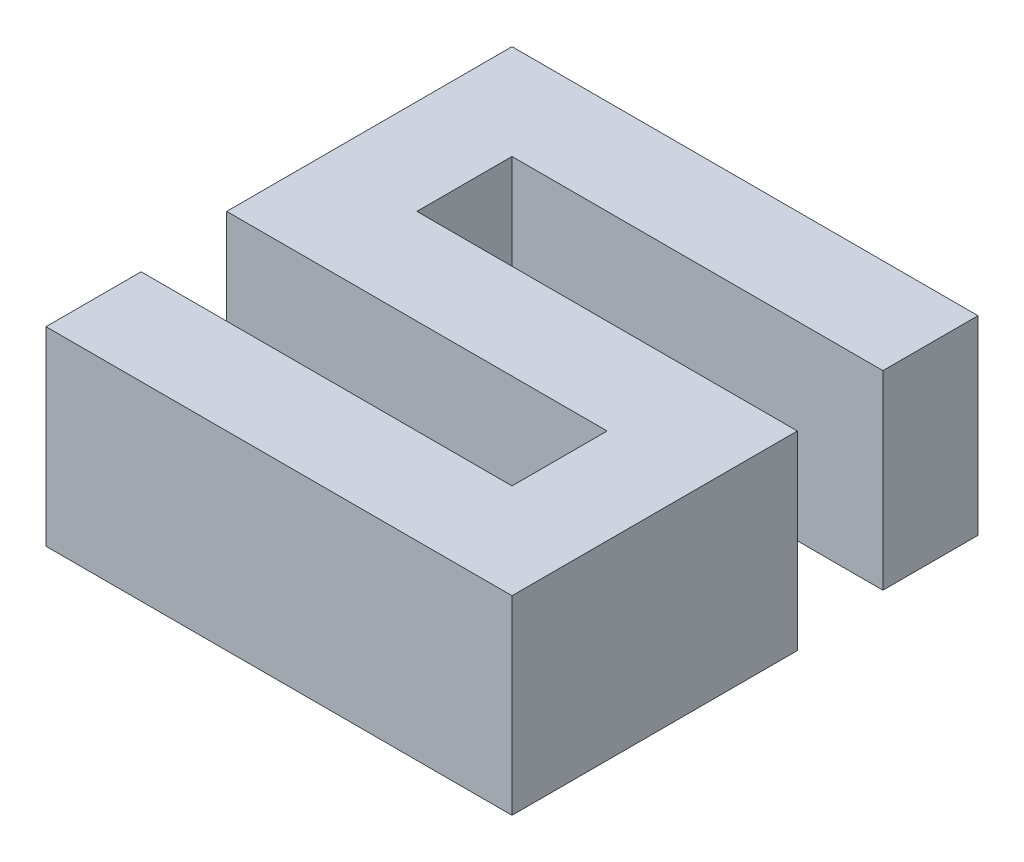
ISO-10303-21;
HEADER;
FILE_DESCRIPTION(('STEP AP214'),'2;1');
FILE_NAME('part.step','',(''),(''),'','','');
FILE_SCHEMA(('AUTOMOTIVE_DESIGN { 1 0 10303 214 1 1 1 1 }'));
ENDSEC;
DATA;
#1=APPLICATION_CONTEXT('core data for automotive mechanical design processes');
#2=APPLICATION_PROTOCOL_DEFINITION('international standard','automotive_design',2000,#1);
#3=PRODUCT_CONTEXT('',#1,'mechanical');
#4=PRODUCT('Part','Part','',(#3));
#5=PRODUCT_RELATED_PRODUCT_CATEGORY('part','',(#4));
#6=PRODUCT_DEFINITION_FORMATION('','',#4);
#7=PRODUCT_DEFINITION_CONTEXT('part definition',#1,'design');
#8=PRODUCT_DEFINITION('design','',#6,#7);
#9=PRODUCT_DEFINITION_SHAPE('','',#8);
#10=(LENGTH_UNIT() NAMED_UNIT(*) SI_UNIT(.MILLI.,.METRE.));
#11=(NAMED_UNIT(*) PLANE_ANGLE_UNIT() SI_UNIT($,.RADIAN.));
#12=(NAMED_UNIT(*) SI_UNIT($,.STERADIAN.) SOLID_ANGLE_UNIT());
#13=UNCERTAINTY_MEASURE_WITH_UNIT(LENGTH_MEASURE(1.E-05),#10,'distance_accuracy_value','');
#14=(GEOMETRIC_REPRESENTATION_CONTEXT(3) GLOBAL_UNCERTAINTY_ASSIGNED_CONTEXT((#13)) GLOBAL_UNIT_ASSIGNED_CONTEXT((#10,
#11,#12)) REPRESENTATION_CONTEXT('',''));
#15=CARTESIAN_POINT('',(0.,0.,0.));
#16=DIRECTION('',(0.,0.,1.));
#17=DIRECTION('',(1.,0.,0.));
#18=AXIS2_PLACEMENT_3D('',#15,#16,#17);
#19=CARTESIAN_POINT('',(42.0654911838791,50.,37.5));
#20=DIRECTION('',(0.,0.,1.));
#21=DIRECTION('',(1.,0.,0.));
#22=AXIS2_PLACEMENT_3D('',#19,#20,#21);
#23=PLANE('',#22);
#24=DIRECTION('',(-1.,0.,0.));
#25=VECTOR('',#24,1.);
#26=CARTESIAN_POINT('',(42.0654911838791,0.,37.5));
#27=LINE('',#26,#25);
#28=CARTESIAN_POINT('',(29.5654911838791,0.,37.5));
#29=VERTEX_POINT('',#28);
#30=CARTESIAN_POINT('',(-67.9345088161209,0.,37.5));
#31=VERTEX_POINT('',#30);
#32=EDGE_CURVE('E170',#29,#31,#27,.T.);
#33=ORIENTED_EDGE('',*,*,#32,.T.);
#34=DIRECTION('',(0.,-1.,0.));
#35=VECTOR('',#34,1.);
#36=CARTESIAN_POINT('',(-67.9345088161209,50.,37.5));
#37=LINE('',#36,#35);
#38=CARTESIAN_POINT('',(-67.9345088161209,50.,37.5));
#39=VERTEX_POINT('',#38);
#40=EDGE_CURVE('E11',#39,#31,#37,.T.);
#41=ORIENTED_EDGE('',*,*,#40,.F.);
#42=DIRECTION('',(-1.,0.,0.));
#43=VECTOR('',#42,1.);
#44=CARTESIAN_POINT('',(42.0654911838791,50.,37.5));
#45=LINE('',#44,#43);
#46=CARTESIAN_POINT('',(29.5654911838791,50.,37.5));
#47=VERTEX_POINT('',#46);
#48=EDGE_CURVE('E114',#47,#39,#45,.T.);
#49=ORIENTED_EDGE('',*,*,#48,.F.);
#50=DIRECTION('',(0.,-1.,0.));
#51=VECTOR('',#50,1.);
#52=CARTESIAN_POINT('',(29.5654911838791,50.,37.5));
#53=LINE('',#52,#51);
#54=EDGE_CURVE('E166',#47,#29,#53,.T.);
#55=ORIENTED_EDGE('',*,*,#54,.T.);
#56=EDGE_LOOP('',(#33,#41,#49,#55));
#57=FACE_BOUND('',#56,.T.);
#58=ADVANCED_FACE('F45',(#57),#23,.F.);
#59=CARTESIAN_POINT('',(-67.9345088161209,50.,62.5));
#60=DIRECTION('',(-1.,0.,0.));
#61=DIRECTION('',(0.,0.,1.));
#62=AXIS2_PLACEMENT_3D('',#59,#60,#61);
#63=PLANE('',#62);
#64=DIRECTION('',(0.,0.,-1.));
#65=VECTOR('',#64,1.);
#66=CARTESIAN_POINT('',(-67.9345088161209,0.,62.5));
#67=LINE('',#66,#65);
#68=CARTESIAN_POINT('',(-67.9345088161209,0.,62.5));
#69=VERTEX_POINT('',#68);
#70=EDGE_CURVE('E174',#69,#31,#67,.T.);
#71=ORIENTED_EDGE('',*,*,#70,.F.);
#72=DIRECTION('',(0.,-1.,0.));
#73=VECTOR('',#72,1.);
#74=CARTESIAN_POINT('',(-67.9345088161209,50.,62.5));
#75=LINE('',#74,#73);
#76=CARTESIAN_POINT('',(-67.9345088161209,50.,62.5));
#77=VERTEX_POINT('',#76);
#78=EDGE_CURVE('E54',#77,#69,#75,.T.);
#79=ORIENTED_EDGE('',*,*,#78,.F.);
#80=DIRECTION('',(0.,0.,-1.));
#81=VECTOR('',#80,1.);
#82=CARTESIAN_POINT('',(-67.9345088161209,50.,62.5));
#83=LINE('',#82,#81);
#84=EDGE_CURVE('E257',#77,#39,#83,.T.);
#85=ORIENTED_EDGE('',*,*,#84,.T.);
#86=ORIENTED_EDGE('',*,*,#40,.T.);
#87=EDGE_LOOP('',(#71,#79,#85,#86));
#88=FACE_BOUND('',#87,.T.);
#89=ADVANCED_FACE('F244',(#88),#63,.T.);
#90=CARTESIAN_POINT('',(42.0654911838791,50.,62.5));
#91=DIRECTION('',(0.,0.,1.));
#92=DIRECTION('',(1.,0.,0.));
#93=AXIS2_PLACEMENT_3D('',#90,#91,#92);
#94=PLANE('',#93);
#95=DIRECTION('',(-1.,0.,0.));
#96=VECTOR('',#95,1.);
#97=CARTESIAN_POINT('',(42.0654911838791,0.,62.5));
#98=LINE('',#97,#96);
#99=CARTESIAN_POINT('',(54.5654911838791,0.,62.5));
#100=VERTEX_POINT('',#99);
#101=EDGE_CURVE('E178',#100,#69,#98,.T.);
#102=ORIENTED_EDGE('',*,*,#101,.F.);
#103=DIRECTION('',(0.,-1.,0.));
#104=VECTOR('',#103,1.);
#105=CARTESIAN_POINT('',(54.5654911838791,50.,62.5));
#106=LINE('',#105,#104);
#107=CARTESIAN_POINT('',(54.5654911838791,50.,62.5));
#108=VERTEX_POINT('',#107);
#109=EDGE_CURVE('E232',#108,#100,#106,.T.);
#110=ORIENTED_EDGE('',*,*,#109,.F.);
#111=DIRECTION('',(-1.,0.,0.));
#112=VECTOR('',#111,1.);
#113=CARTESIAN_POINT('',(42.0654911838791,50.,62.5));
#114=LINE('',#113,#112);
#115=EDGE_CURVE('E241',#108,#77,#114,.T.);
#116=ORIENTED_EDGE('',*,*,#115,.T.);
#117=ORIENTED_EDGE('',*,*,#78,.T.);
#118=EDGE_LOOP('',(#102,#110,#116,#117));
#119=FACE_BOUND('',#118,.T.);
#120=ADVANCED_FACE('F239',(#119),#94,.T.);
#121=CARTESIAN_POINT('',(54.5654911838791,50.,0.));
#122=DIRECTION('',(1.,0.,0.));
#123=DIRECTION('',(0.,0.,-1.));
#124=AXIS2_PLACEMENT_3D('',#121,#122,#123);
#125=PLANE('',#124);
#126=DIRECTION('',(0.,0.,1.));
#127=VECTOR('',#126,1.);
#128=CARTESIAN_POINT('',(54.5654911838791,0.,0.));
#129=LINE('',#128,#127);
#130=CARTESIAN_POINT('',(54.5654911838791,0.,-12.5));
#131=VERTEX_POINT('',#130);
#132=EDGE_CURVE('E182',#131,#100,#129,.T.);
#133=ORIENTED_EDGE('',*,*,#132,.F.);
#134=DIRECTION('',(0.,-1.,0.));
#135=VECTOR('',#134,1.);
#136=CARTESIAN_POINT('',(54.5654911838791,50.,-12.5));
#137=LINE('',#136,#135);
#138=CARTESIAN_POINT('',(54.5654911838791,50.,-12.5));
#139=VERTEX_POINT('',#138);
#140=EDGE_CURVE('E229',#139,#131,#137,.T.);
#141=ORIENTED_EDGE('',*,*,#140,.F.);
#142=DIRECTION('',(0.,0.,1.));
#143=VECTOR('',#142,1.);
#144=CARTESIAN_POINT('',(54.5654911838791,50.,0.));
#145=LINE('',#144,#143);
#146=EDGE_CURVE('E254',#139,#108,#145,.T.);
#147=ORIENTED_EDGE('',*,*,#146,.T.);
#148=ORIENTED_EDGE('',*,*,#109,.T.);
#149=EDGE_LOOP('',(#133,#141,#147,#148));
#150=FACE_BOUND('',#149,.T.);
#151=ADVANCED_FACE('F251',(#150),#125,.T.);
#152=CARTESIAN_POINT('',(-57.9345088161209,50.,-12.5));
#153=DIRECTION('',(0.,0.,-1.));
#154=DIRECTION('',(-1.,0.,0.));
#155=AXIS2_PLACEMENT_3D('',#152,#153,#154);
#156=PLANE('',#155);
#157=DIRECTION('',(1.,0.,0.));
#158=VECTOR('',#157,1.);
#159=CARTESIAN_POINT('',(-57.9345088161209,0.,-12.5));
#160=LINE('',#159,#158);
#161=CARTESIAN_POINT('',(-45.4345088161209,0.,-12.5));
#162=VERTEX_POINT('',#161);
#163=EDGE_CURVE('E186',#162,#131,#160,.T.);
#164=ORIENTED_EDGE('',*,*,#163,.F.);
#165=DIRECTION('',(0.,-1.,0.));
#166=VECTOR('',#165,1.);
#167=CARTESIAN_POINT('',(-45.4345088161209,50.,-12.5));
#168=LINE('',#167,#166);
#169=CARTESIAN_POINT('',(-45.4345088161209,50.,-12.5));
#170=VERTEX_POINT('',#169);
#171=EDGE_CURVE('E226',#170,#162,#168,.T.);
#172=ORIENTED_EDGE('',*,*,#171,.F.);
#173=DIRECTION('',(1.,0.,0.));
#174=VECTOR('',#173,1.);
#175=CARTESIAN_POINT('',(-57.9345088161209,50.,-12.5));
#176=LINE('',#175,#174);
#177=EDGE_CURVE('E262',#170,#139,#176,.T.);
#178=ORIENTED_EDGE('',*,*,#177,.T.);
#179=ORIENTED_EDGE('',*,*,#140,.T.);
#180=EDGE_LOOP('',(#164,#172,#178,#179));
#181=FACE_BOUND('',#180,.T.);
#182=ADVANCED_FACE('F369',(#181),#156,.T.);
#183=CARTESIAN_POINT('',(-45.4345088161209,50.,-50.));
#184=DIRECTION('',(1.,0.,0.));
#185=DIRECTION('',(0.,0.,-1.));
#186=AXIS2_PLACEMENT_3D('',#183,#184,#185);
#187=PLANE('',#186);
#188=DIRECTION('',(0.,0.,-1.));
#189=VECTOR('',#188,1.);
#190=CARTESIAN_POINT('',(-45.4345088161209,0.,-50.));
#191=LINE('',#190,#189);
#192=CARTESIAN_POINT('',(-45.4345088161209,0.,-37.5));
#193=VERTEX_POINT('',#192);
#194=EDGE_CURVE('E190',#193,#162,#191,.F.);
#195=ORIENTED_EDGE('',*,*,#194,.F.);
#196=DIRECTION('',(0.,-1.,0.));
#197=VECTOR('',#196,1.);
#198=CARTESIAN_POINT('',(-45.4345088161209,50.,-37.5));
#199=LINE('',#198,#197);
#200=CARTESIAN_POINT('',(-45.4345088161209,50.,-37.5));
#201=VERTEX_POINT('',#200);
#202=EDGE_CURVE('E223',#201,#193,#199,.T.);
#203=ORIENTED_EDGE('',*,*,#202,.F.);
#204=DIRECTION('',(0.,0.,-1.));
#205=VECTOR('',#204,1.);
#206=CARTESIAN_POINT('',(-45.4345088161209,50.,-50.));
#207=LINE('',#206,#205);
#208=EDGE_CURVE('E269',#201,#170,#207,.F.);
#209=ORIENTED_EDGE('',*,*,#208,.T.);
#210=ORIENTED_EDGE('',*,*,#171,.T.);
#211=EDGE_LOOP('',(#195,#203,#209,#210));
#212=FACE_BOUND('',#211,.T.);
#213=ADVANCED_FACE('F360',(#212),#187,.T.);
#214=CARTESIAN_POINT('',(52.0654911838791,50.,-37.5));
#215=DIRECTION('',(0.,0.,1.));
#216=DIRECTION('',(1.,0.,0.));
#217=AXIS2_PLACEMENT_3D('',#214,#215,#216);
#218=PLANE('',#217);
#219=DIRECTION('',(-1.,0.,0.));
#220=VECTOR('',#219,1.);
#221=CARTESIAN_POINT('',(52.0654911838791,0.,-37.5));
#222=LINE('',#221,#220);
#223=CARTESIAN_POINT('',(52.0654911838791,0.,-37.5));
#224=VERTEX_POINT('',#223);
#225=EDGE_CURVE('E194',#224,#193,#222,.T.);
#226=ORIENTED_EDGE('',*,*,#225,.F.);
#227=DIRECTION('',(0.,-1.,0.));
#228=VECTOR('',#227,1.);
#229=CARTESIAN_POINT('',(52.0654911838791,50.,-37.5));
#230=LINE('',#229,#228);
#231=CARTESIAN_POINT('',(52.0654911838791,50.,-37.5));
#232=VERTEX_POINT('',#231);
#233=EDGE_CURVE('E220',#232,#224,#230,.T.);
#234=ORIENTED_EDGE('',*,*,#233,.F.);
#235=DIRECTION('',(-1.,0.,0.));
#236=VECTOR('',#235,1.);
#237=CARTESIAN_POINT('',(52.0654911838791,50.,-37.5));
#238=LINE('',#237,#236);
#239=EDGE_CURVE('E273',#232,#201,#238,.T.);
#240=ORIENTED_EDGE('',*,*,#239,.T.);
#241=ORIENTED_EDGE('',*,*,#202,.T.);
#242=EDGE_LOOP('',(#226,#234,#240,#241));
#243=FACE_BOUND('',#242,.T.);
#244=ADVANCED_FACE('F288',(#243),#218,.T.);
#245=CARTESIAN_POINT('',(52.0654911838791,50.,-62.5));
#246=DIRECTION('',(1.,0.,0.));
#247=DIRECTION('',(0.,0.,-1.));
#248=AXIS2_PLACEMENT_3D('',#245,#246,#247);
#249=PLANE('',#248);
#250=DIRECTION('',(0.,0.,1.));
#251=VECTOR('',#250,1.);
#252=CARTESIAN_POINT('',(52.0654911838791,0.,-62.5));
#253=LINE('',#252,#251);
#254=CARTESIAN_POINT('',(52.0654911838791,0.,-62.5));
#255=VERTEX_POINT('',#254);
#256=EDGE_CURVE('E198',#255,#224,#253,.T.);
#257=ORIENTED_EDGE('',*,*,#256,.F.);
#258=DIRECTION('',(0.,-1.,0.));
#259=VECTOR('',#258,1.);
#260=CARTESIAN_POINT('',(52.0654911838791,50.,-62.5));
#261=LINE('',#260,#259);
#262=CARTESIAN_POINT('',(52.0654911838791,50.,-62.5));
#263=VERTEX_POINT('',#262);
#264=EDGE_CURVE('E217',#263,#255,#261,.T.);
#265=ORIENTED_EDGE('',*,*,#264,.F.);
#266=DIRECTION('',(0.,0.,1.));
#267=VECTOR('',#266,1.);
#268=CARTESIAN_POINT('',(52.0654911838791,50.,-62.5));
#269=LINE('',#268,#267);
#270=EDGE_CURVE('E277',#263,#232,#269,.T.);
#271=ORIENTED_EDGE('',*,*,#270,.T.);
#272=ORIENTED_EDGE('',*,*,#233,.T.);
#273=EDGE_LOOP('',(#257,#265,#271,#272));
#274=FACE_BOUND('',#273,.T.);
#275=ADVANCED_FACE('F283',(#274),#249,.T.);
#276=CARTESIAN_POINT('',(52.0654911838791,50.,-62.5));
#277=DIRECTION('',(0.,0.,1.));
#278=DIRECTION('',(1.,0.,0.));
#279=AXIS2_PLACEMENT_3D('',#276,#277,#278);
#280=PLANE('',#279);
#281=DIRECTION('',(-1.,0.,0.));
#282=VECTOR('',#281,1.);
#283=CARTESIAN_POINT('',(52.0654911838791,0.,-62.5));
#284=LINE('',#283,#282);
#285=CARTESIAN_POINT('',(-70.4345088161209,0.,-62.5));
#286=VERTEX_POINT('',#285);
#287=EDGE_CURVE('E202',#255,#286,#284,.T.);
#288=ORIENTED_EDGE('',*,*,#287,.T.);
#289=DIRECTION('',(0.,-1.,0.));
#290=VECTOR('',#289,1.);
#291=CARTESIAN_POINT('',(-70.4345088161209,50.,-62.5));
#292=LINE('',#291,#290);
#293=CARTESIAN_POINT('',(-70.4345088161209,50.,-62.5));
#294=VERTEX_POINT('',#293);
#295=EDGE_CURVE('E159',#294,#286,#292,.T.);
#296=ORIENTED_EDGE('',*,*,#295,.F.);
#297=DIRECTION('',(-1.,0.,0.));
#298=VECTOR('',#297,1.);
#299=CARTESIAN_POINT('',(52.0654911838791,50.,-62.5));
#300=LINE('',#299,#298);
#301=EDGE_CURVE('E148',#263,#294,#300,.T.);
#302=ORIENTED_EDGE('',*,*,#301,.F.);
#303=ORIENTED_EDGE('',*,*,#264,.T.);
#304=EDGE_LOOP('',(#288,#296,#302,#303));
#305=FACE_BOUND('',#304,.T.);
#306=ADVANCED_FACE('F292',(#305),#280,.F.);
#307=CARTESIAN_POINT('',(-70.4345088161209,50.,-50.));
#308=DIRECTION('',(1.,0.,0.));
#309=DIRECTION('',(0.,0.,-1.));
#310=AXIS2_PLACEMENT_3D('',#307,#308,#309);
#311=PLANE('',#310);
#312=DIRECTION('',(0.,0.,-1.));
#313=VECTOR('',#312,1.);
#314=CARTESIAN_POINT('',(-70.4345088161209,0.,-50.));
#315=LINE('',#314,#313);
#316=CARTESIAN_POINT('',(-70.4345088161209,0.,12.5));
#317=VERTEX_POINT('',#316);
#318=EDGE_CURVE('E157',#286,#317,#315,.F.);
#319=ORIENTED_EDGE('',*,*,#318,.T.);
#320=DIRECTION('',(0.,-1.,0.));
#321=VECTOR('',#320,1.);
#322=CARTESIAN_POINT('',(-70.4345088161209,50.,12.5));
#323=LINE('',#322,#321);
#324=CARTESIAN_POINT('',(-70.4345088161209,50.,12.5));
#325=VERTEX_POINT('',#324);
#326=EDGE_CURVE('E154',#325,#317,#323,.T.);
#327=ORIENTED_EDGE('',*,*,#326,.F.);
#328=DIRECTION('',(0.,0.,-1.));
#329=VECTOR('',#328,1.);
#330=CARTESIAN_POINT('',(-70.4345088161209,50.,-50.));
#331=LINE('',#330,#329);
#332=EDGE_CURVE('E141',#294,#325,#331,.F.);
#333=ORIENTED_EDGE('',*,*,#332,.F.);
#334=ORIENTED_EDGE('',*,*,#295,.T.);
#335=EDGE_LOOP('',(#319,#327,#333,#334));
#336=FACE_BOUND('',#335,.T.);
#337=ADVANCED_FACE('F155',(#336),#311,.F.);
#338=CARTESIAN_POINT('',(-57.9345088161209,50.,12.5));
#339=DIRECTION('',(0.,0.,-1.));
#340=DIRECTION('',(-1.,0.,0.));
#341=AXIS2_PLACEMENT_3D('',#338,#339,#340);
#342=PLANE('',#341);
#343=DIRECTION('',(1.,0.,0.));
#344=VECTOR('',#343,1.);
#345=CARTESIAN_POINT('',(-57.9345088161209,0.,12.5));
#346=LINE('',#345,#344);
#347=CARTESIAN_POINT('',(29.5654911838791,0.,12.5));
#348=VERTEX_POINT('',#347);
#349=EDGE_CURVE('E102',#317,#348,#346,.T.);
#350=ORIENTED_EDGE('',*,*,#349,.T.);
#351=DIRECTION('',(0.,-1.,0.));
#352=VECTOR('',#351,1.);
#353=CARTESIAN_POINT('',(29.5654911838791,50.,12.5));
#354=LINE('',#353,#352);
#355=CARTESIAN_POINT('',(29.5654911838791,50.,12.5));
#356=VERTEX_POINT('',#355);
#357=EDGE_CURVE('E160',#356,#348,#354,.T.);
#358=ORIENTED_EDGE('',*,*,#357,.F.);
#359=DIRECTION('',(1.,0.,0.));
#360=VECTOR('',#359,1.);
#361=CARTESIAN_POINT('',(-57.9345088161209,50.,12.5));
#362=LINE('',#361,#360);
#363=EDGE_CURVE('E145',#325,#356,#362,.T.);
#364=ORIENTED_EDGE('',*,*,#363,.F.);
#365=ORIENTED_EDGE('',*,*,#326,.T.);
#366=EDGE_LOOP('',(#350,#358,#364,#365));
#367=FACE_BOUND('',#366,.T.);
#368=ADVANCED_FACE('F162',(#367),#342,.F.);
#369=CARTESIAN_POINT('',(29.5654911838791,50.,0.));
#370=DIRECTION('',(1.,0.,0.));
#371=DIRECTION('',(0.,0.,-1.));
#372=AXIS2_PLACEMENT_3D('',#369,#370,#371);
#373=PLANE('',#372);
#374=DIRECTION('',(0.,0.,1.));
#375=VECTOR('',#374,1.);
#376=CARTESIAN_POINT('',(29.5654911838791,0.,0.));
#377=LINE('',#376,#375);
#378=EDGE_CURVE('E108',#348,#29,#377,.T.);
#379=ORIENTED_EDGE('',*,*,#378,.T.);
#380=ORIENTED_EDGE('',*,*,#54,.F.);
#381=DIRECTION('',(0.,0.,1.));
#382=VECTOR('',#381,1.);
#383=CARTESIAN_POINT('',(29.5654911838791,50.,0.));
#384=LINE('',#383,#382);
#385=EDGE_CURVE('E62',#356,#47,#384,.T.);
#386=ORIENTED_EDGE('',*,*,#385,.F.);
#387=ORIENTED_EDGE('',*,*,#357,.T.);
#388=EDGE_LOOP('',(#379,#380,#386,#387));
#389=FACE_BOUND('',#388,.T.);
#390=ADVANCED_FACE('F306',(#389),#373,.F.);
#391=CARTESIAN_POINT('',(0.,50.,0.));
#392=DIRECTION('',(0.,-1.,0.));
#393=DIRECTION('',(-1.,0.,0.));
#394=AXIS2_PLACEMENT_3D('',#391,#392,#393);
#395=PLANE('',#394);
#396=ORIENTED_EDGE('',*,*,#48,.T.);
#397=ORIENTED_EDGE('',*,*,#84,.F.);
#398=ORIENTED_EDGE('',*,*,#115,.F.);
#399=ORIENTED_EDGE('',*,*,#146,.F.);
#400=ORIENTED_EDGE('',*,*,#177,.F.);
#401=ORIENTED_EDGE('',*,*,#208,.F.);
#402=ORIENTED_EDGE('',*,*,#239,.F.);
#403=ORIENTED_EDGE('',*,*,#270,.F.);
#404=ORIENTED_EDGE('',*,*,#301,.T.);
#405=ORIENTED_EDGE('',*,*,#332,.T.);
#406=ORIENTED_EDGE('',*,*,#363,.T.);
#407=ORIENTED_EDGE('',*,*,#385,.T.);
#408=EDGE_LOOP('',(#396,#397,#398,#399,#400,#401,#402,#403,#404,#405,#406,#407));
#409=FACE_BOUND('',#408,.T.);
#410=ADVANCED_FACE('F143',(#409),#395,.F.);
#411=CARTESIAN_POINT('',(0.,0.,0.));
#412=DIRECTION('',(0.,-1.,0.));
#413=DIRECTION('',(-1.,0.,0.));
#414=AXIS2_PLACEMENT_3D('',#411,#412,#413);
#415=PLANE('',#414);
#416=ORIENTED_EDGE('',*,*,#32,.F.);
#417=ORIENTED_EDGE('',*,*,#378,.F.);
#418=ORIENTED_EDGE('',*,*,#349,.F.);
#419=ORIENTED_EDGE('',*,*,#318,.F.);
#420=ORIENTED_EDGE('',*,*,#287,.F.);
#421=ORIENTED_EDGE('',*,*,#256,.T.);
#422=ORIENTED_EDGE('',*,*,#225,.T.);
#423=ORIENTED_EDGE('',*,*,#194,.T.);
#424=ORIENTED_EDGE('',*,*,#163,.T.);
#425=ORIENTED_EDGE('',*,*,#132,.T.);
#426=ORIENTED_EDGE('',*,*,#101,.T.);
#427=ORIENTED_EDGE('',*,*,#70,.T.);
#428=EDGE_LOOP('',(#416,#417,#418,#419,#420,#421,#422,#423,#424,#425,#426,#427));
#429=FACE_BOUND('',#428,.T.);
#430=ADVANCED_FACE('F247',(#429),#415,.T.);
#431=CLOSED_SHELL('',(#58,#89,#120,#151,#182,#213,#244,#275,#306,#337,#368,#390,#410,#430));
#432=MANIFOLD_SOLID_BREP('B2',#431);
#433=ADVANCED_BREP_SHAPE_REPRESENTATION('',(#18,#432),#14);
#434=SHAPE_DEFINITION_REPRESENTATION(#9,#433);
ENDSEC;
END-ISO-10303-21;
